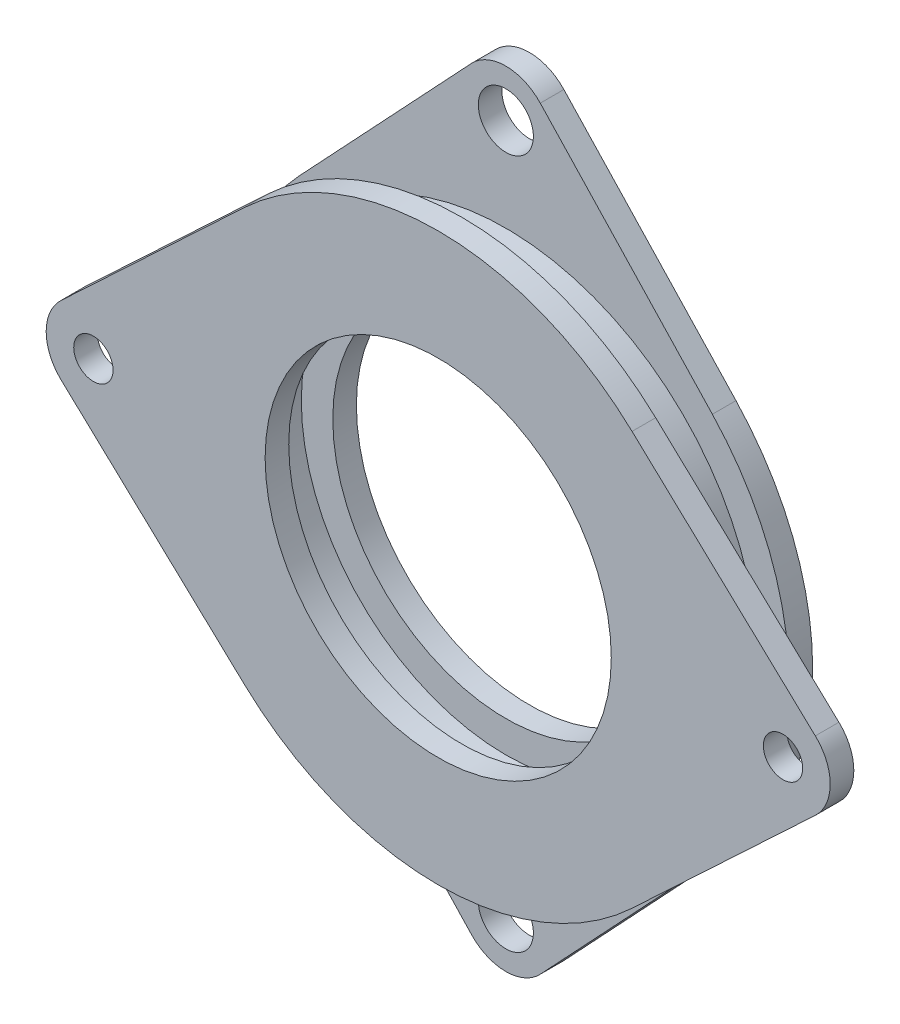
ISO-10303-21;
HEADER;
FILE_DESCRIPTION(('STEP AP214'),'2;1');
FILE_NAME('part.step','',(''),(''),'','','');
FILE_SCHEMA(('AUTOMOTIVE_DESIGN { 1 0 10303 214 1 1 1 1 }'));
ENDSEC;
DATA;
#1=APPLICATION_CONTEXT('core data for automotive mechanical design processes');
#2=APPLICATION_PROTOCOL_DEFINITION('international standard','automotive_design',2000,#1);
#3=PRODUCT_CONTEXT('',#1,'mechanical');
#4=PRODUCT('Part','Part','',(#3));
#5=PRODUCT_RELATED_PRODUCT_CATEGORY('part','',(#4));
#6=PRODUCT_DEFINITION_FORMATION('','',#4);
#7=PRODUCT_DEFINITION_CONTEXT('part definition',#1,'design');
#8=PRODUCT_DEFINITION('design','',#6,#7);
#9=PRODUCT_DEFINITION_SHAPE('','',#8);
#10=(LENGTH_UNIT() NAMED_UNIT(*) SI_UNIT(.MILLI.,.METRE.));
#11=(NAMED_UNIT(*) PLANE_ANGLE_UNIT() SI_UNIT($,.RADIAN.));
#12=(NAMED_UNIT(*) SI_UNIT($,.STERADIAN.) SOLID_ANGLE_UNIT());
#13=UNCERTAINTY_MEASURE_WITH_UNIT(LENGTH_MEASURE(1.E-05),#10,'distance_accuracy_value','');
#14=(GEOMETRIC_REPRESENTATION_CONTEXT(3) GLOBAL_UNCERTAINTY_ASSIGNED_CONTEXT((#13)) GLOBAL_UNIT_ASSIGNED_CONTEXT((#10,
#11,#12)) REPRESENTATION_CONTEXT('',''));
#15=CARTESIAN_POINT('',(0.,0.,0.));
#16=DIRECTION('',(0.,0.,1.));
#17=DIRECTION('',(1.,0.,0.));
#18=AXIS2_PLACEMENT_3D('',#15,#16,#17);
#19=CARTESIAN_POINT('',(0.,21.92,0.));
#20=DIRECTION('',(0.,0.,1.));
#21=DIRECTION('',(1.,0.,0.));
#22=AXIS2_PLACEMENT_3D('',#19,#20,#21);
#23=PLANE('',#22);
#24=CARTESIAN_POINT('',(0.,0.,0.));
#25=DIRECTION('',(0.,0.,-1.));
#26=DIRECTION('',(-1.,0.,0.));
#27=AXIS2_PLACEMENT_3D('',#24,#25,#26);
#28=CIRCLE('',#27,11.);
#29=CARTESIAN_POINT('',(-11.,0.,0.));
#30=VERTEX_POINT('',#29);
#31=EDGE_CURVE('E151',#30,#30,#28,.F.);
#32=ORIENTED_EDGE('',*,*,#31,.T.);
#33=EDGE_LOOP('',(#32));
#34=FACE_BOUND('',#33,.T.);
#35=CARTESIAN_POINT('',(0.,21.92,0.));
#36=DIRECTION('',(0.,0.,-1.));
#37=DIRECTION('',(-1.,0.,0.));
#38=AXIS2_PLACEMENT_3D('',#35,#36,#37);
#39=CIRCLE('',#38,1.75);
#40=CARTESIAN_POINT('',(-1.75,21.92,0.));
#41=VERTEX_POINT('',#40);
#42=EDGE_CURVE('E19',#41,#41,#39,.F.);
#43=ORIENTED_EDGE('',*,*,#42,.T.);
#44=EDGE_LOOP('',(#43));
#45=FACE_BOUND('',#44,.T.);
#46=CARTESIAN_POINT('',(0.,-21.92,0.));
#47=DIRECTION('',(0.,0.,-1.));
#48=DIRECTION('',(-1.,0.,0.));
#49=AXIS2_PLACEMENT_3D('',#46,#47,#48);
#50=CIRCLE('',#49,1.75);
#51=CARTESIAN_POINT('',(-1.75,-21.92,0.));
#52=VERTEX_POINT('',#51);
#53=EDGE_CURVE('E148',#52,#52,#50,.F.);
#54=ORIENTED_EDGE('',*,*,#53,.T.);
#55=EDGE_LOOP('',(#54));
#56=FACE_BOUND('',#55,.T.);
#57=DIRECTION('',(0.684306569343064,-0.729194431653127,0.));
#58=VECTOR('',#57,1.);
#59=CARTESIAN_POINT('',(2.18758329495941,23.9729197080292,0.));
#60=LINE('',#59,#58);
#61=CARTESIAN_POINT('',(2.18758329495941,23.9729197080292,0.));
#62=VERTEX_POINT('',#61);
#63=CARTESIAN_POINT('',(13.1254997697563,12.3175182481751,0.));
#64=VERTEX_POINT('',#63);
#65=EDGE_CURVE('E130',#62,#64,#60,.T.);
#66=ORIENTED_EDGE('',*,*,#65,.T.);
#67=CARTESIAN_POINT('',(0.,0.,0.));
#68=DIRECTION('',(0.,0.,-1.));
#69=DIRECTION('',(-1.,0.,0.));
#70=AXIS2_PLACEMENT_3D('',#67,#68,#69);
#71=CIRCLE('',#70,18.);
#72=CARTESIAN_POINT('',(13.1254997697563,-12.3175182481751,0.));
#73=VERTEX_POINT('',#72);
#74=EDGE_CURVE('E159',#73,#64,#71,.F.);
#75=ORIENTED_EDGE('',*,*,#74,.F.);
#76=DIRECTION('',(-0.684306569343064,-0.729194431653127,0.));
#77=VECTOR('',#76,1.);
#78=CARTESIAN_POINT('',(13.1254997697563,-12.3175182481751,0.));
#79=LINE('',#78,#77);
#80=CARTESIAN_POINT('',(2.1875832949594,-23.9729197080292,0.));
#81=VERTEX_POINT('',#80);
#82=EDGE_CURVE('E156',#73,#81,#79,.T.);
#83=ORIENTED_EDGE('',*,*,#82,.T.);
#84=CARTESIAN_POINT('',(0.,-21.92,0.));
#85=DIRECTION('',(0.,0.,-1.));
#86=DIRECTION('',(-1.,0.,0.));
#87=AXIS2_PLACEMENT_3D('',#84,#85,#86);
#88=CIRCLE('',#87,3.00000000000003);
#89=CARTESIAN_POINT('',(-2.18758329495941,-23.9729197080292,0.));
#90=VERTEX_POINT('',#89);
#91=EDGE_CURVE('E164',#90,#81,#88,.F.);
#92=ORIENTED_EDGE('',*,*,#91,.F.);
#93=DIRECTION('',(-0.684306569343064,0.729194431653127,0.));
#94=VECTOR('',#93,1.);
#95=CARTESIAN_POINT('',(-13.1254997697563,-12.3175182481751,0.));
#96=LINE('',#95,#94);
#97=CARTESIAN_POINT('',(-13.1254997697563,-12.3175182481751,0.));
#98=VERTEX_POINT('',#97);
#99=EDGE_CURVE('E161',#90,#98,#96,.T.);
#100=ORIENTED_EDGE('',*,*,#99,.T.);
#101=CARTESIAN_POINT('',(0.,0.,0.));
#102=DIRECTION('',(0.,0.,-1.));
#103=DIRECTION('',(-1.,0.,0.));
#104=AXIS2_PLACEMENT_3D('',#101,#102,#103);
#105=CIRCLE('',#104,18.);
#106=CARTESIAN_POINT('',(-13.1254997697563,12.3175182481751,0.));
#107=VERTEX_POINT('',#106);
#108=EDGE_CURVE('E166',#107,#98,#105,.F.);
#109=ORIENTED_EDGE('',*,*,#108,.F.);
#110=DIRECTION('',(0.684306569343064,0.729194431653127,0.));
#111=VECTOR('',#110,1.);
#112=CARTESIAN_POINT('',(-2.18758329495941,23.9729197080292,0.));
#113=LINE('',#112,#111);
#114=CARTESIAN_POINT('',(-2.18758329495941,23.9729197080292,0.));
#115=VERTEX_POINT('',#114);
#116=EDGE_CURVE('E133',#107,#115,#113,.T.);
#117=ORIENTED_EDGE('',*,*,#116,.T.);
#118=CARTESIAN_POINT('',(0.,21.92,0.));
#119=DIRECTION('',(0.,0.,-1.));
#120=DIRECTION('',(-1.,0.,0.));
#121=AXIS2_PLACEMENT_3D('',#118,#119,#120);
#122=CIRCLE('',#121,3.00000000000003);
#123=EDGE_CURVE('E127',#62,#115,#122,.F.);
#124=ORIENTED_EDGE('',*,*,#123,.F.);
#125=EDGE_LOOP('',(#66,#75,#83,#92,#100,#109,#117,#124));
#126=FACE_BOUND('',#125,.T.);
#127=ADVANCED_FACE('F16',(#34,#45,#56,#126),#23,.F.);
#128=CARTESIAN_POINT('',(0.,21.92,1.5));
#129=DIRECTION('',(0.,0.,-1.));
#130=DIRECTION('',(-1.,0.,0.));
#131=AXIS2_PLACEMENT_3D('',#128,#129,#130);
#132=CYLINDRICAL_SURFACE('',#131,1.75);
#133=ORIENTED_EDGE('',*,*,#42,.F.);
#134=EDGE_LOOP('',(#133));
#135=FACE_BOUND('',#134,.T.);
#136=CARTESIAN_POINT('',(0.,21.92,1.5));
#137=DIRECTION('',(0.,0.,-1.));
#138=DIRECTION('',(-1.,0.,0.));
#139=AXIS2_PLACEMENT_3D('',#136,#137,#138);
#140=CIRCLE('',#139,1.75);
#141=CARTESIAN_POINT('',(-1.75,21.92,1.5));
#142=VERTEX_POINT('',#141);
#143=EDGE_CURVE('E246',#142,#142,#140,.T.);
#144=ORIENTED_EDGE('',*,*,#143,.F.);
#145=EDGE_LOOP('',(#144));
#146=FACE_BOUND('',#145,.T.);
#147=ADVANCED_FACE('F426',(#135,#146),#132,.F.);
#148=CARTESIAN_POINT('',(0.,21.92,1.5));
#149=DIRECTION('',(0.,0.,-1.));
#150=DIRECTION('',(-1.,0.,0.));
#151=AXIS2_PLACEMENT_3D('',#148,#149,#150);
#152=CYLINDRICAL_SURFACE('',#151,3.00000000000003);
#153=CARTESIAN_POINT('',(0.,21.92,1.5));
#154=DIRECTION('',(0.,0.,-1.));
#155=DIRECTION('',(-1.,0.,0.));
#156=AXIS2_PLACEMENT_3D('',#153,#154,#155);
#157=CIRCLE('',#156,3.00000000000003);
#158=CARTESIAN_POINT('',(2.18758329495941,23.9729197080292,1.5));
#159=VERTEX_POINT('',#158);
#160=CARTESIAN_POINT('',(-2.18758329495941,23.9729197080292,1.5));
#161=VERTEX_POINT('',#160);
#162=EDGE_CURVE('E141',#159,#161,#157,.F.);
#163=ORIENTED_EDGE('',*,*,#162,.F.);
#164=DIRECTION('',(0.,0.,1.));
#165=VECTOR('',#164,1.);
#166=CARTESIAN_POINT('',(2.18758329495941,23.9729197080292,1.5));
#167=LINE('',#166,#165);
#168=EDGE_CURVE('E138',#159,#62,#167,.F.);
#169=ORIENTED_EDGE('',*,*,#168,.T.);
#170=ORIENTED_EDGE('',*,*,#123,.T.);
#171=DIRECTION('',(0.,0.,1.));
#172=VECTOR('',#171,1.);
#173=CARTESIAN_POINT('',(-2.18758329495941,23.9729197080292,1.5));
#174=LINE('',#173,#172);
#175=EDGE_CURVE('E136',#115,#161,#174,.T.);
#176=ORIENTED_EDGE('',*,*,#175,.T.);
#177=EDGE_LOOP('',(#163,#169,#170,#176));
#178=FACE_BOUND('',#177,.T.);
#179=ADVANCED_FACE('F139',(#178),#152,.T.);
#180=CARTESIAN_POINT('',(-2.18758329495941,23.9729197080292,1.5));
#181=DIRECTION('',(0.729194431653127,-0.684306569343064,0.));
#182=DIRECTION('',(0.684306569343064,0.729194431653127,0.));
#183=AXIS2_PLACEMENT_3D('',#180,#181,#182);
#184=PLANE('',#183);
#185=DIRECTION('',(0.,0.,-1.));
#186=VECTOR('',#185,1.);
#187=CARTESIAN_POINT('',(-13.1254997697563,12.3175182481751,1.5));
#188=LINE('',#187,#186);
#189=CARTESIAN_POINT('',(-13.1254997697563,12.3175182481751,1.5));
#190=VERTEX_POINT('',#189);
#191=EDGE_CURVE('E255',#190,#107,#188,.T.);
#192=ORIENTED_EDGE('',*,*,#191,.F.);
#193=DIRECTION('',(-0.684306569343064,-0.729194431653127,0.));
#194=VECTOR('',#193,1.);
#195=CARTESIAN_POINT('',(-2.18758329495941,23.9729197080292,1.5));
#196=LINE('',#195,#194);
#197=EDGE_CURVE('E244',#161,#190,#196,.T.);
#198=ORIENTED_EDGE('',*,*,#197,.F.);
#199=ORIENTED_EDGE('',*,*,#175,.F.);
#200=ORIENTED_EDGE('',*,*,#116,.F.);
#201=EDGE_LOOP('',(#192,#198,#199,#200));
#202=FACE_BOUND('',#201,.T.);
#203=ADVANCED_FACE('F421',(#202),#184,.F.);
#204=CARTESIAN_POINT('',(0.,0.,1.5));
#205=DIRECTION('',(0.,0.,-1.));
#206=DIRECTION('',(-1.,0.,0.));
#207=AXIS2_PLACEMENT_3D('',#204,#205,#206);
#208=CYLINDRICAL_SURFACE('',#207,18.);
#209=CARTESIAN_POINT('',(0.,0.,1.5));
#210=DIRECTION('',(0.,0.,-1.));
#211=DIRECTION('',(-1.,0.,0.));
#212=AXIS2_PLACEMENT_3D('',#209,#210,#211);
#213=CIRCLE('',#212,18.);
#214=CARTESIAN_POINT('',(-13.1254997697563,-12.3175182481751,1.5));
#215=VERTEX_POINT('',#214);
#216=EDGE_CURVE('E241',#190,#215,#213,.F.);
#217=ORIENTED_EDGE('',*,*,#216,.F.);
#218=ORIENTED_EDGE('',*,*,#191,.T.);
#219=ORIENTED_EDGE('',*,*,#108,.T.);
#220=DIRECTION('',(0.,0.,1.));
#221=VECTOR('',#220,1.);
#222=CARTESIAN_POINT('',(-13.1254997697563,-12.3175182481751,1.5));
#223=LINE('',#222,#221);
#224=EDGE_CURVE('E165',#98,#215,#223,.T.);
#225=ORIENTED_EDGE('',*,*,#224,.T.);
#226=EDGE_LOOP('',(#217,#218,#219,#225));
#227=FACE_BOUND('',#226,.T.);
#228=ADVANCED_FACE('F417',(#227),#208,.T.);
#229=CARTESIAN_POINT('',(-13.1254997697563,-12.3175182481751,1.5));
#230=DIRECTION('',(0.729194431653127,0.684306569343064,0.));
#231=DIRECTION('',(-0.684306569343064,0.729194431653127,0.));
#232=AXIS2_PLACEMENT_3D('',#229,#230,#231);
#233=PLANE('',#232);
#234=DIRECTION('',(0.,0.,-1.));
#235=VECTOR('',#234,1.);
#236=CARTESIAN_POINT('',(-2.18758329495941,-23.9729197080292,1.5));
#237=LINE('',#236,#235);
#238=CARTESIAN_POINT('',(-2.18758329495941,-23.9729197080292,1.5));
#239=VERTEX_POINT('',#238);
#240=EDGE_CURVE('E254',#239,#90,#237,.T.);
#241=ORIENTED_EDGE('',*,*,#240,.F.);
#242=DIRECTION('',(0.684306569343064,-0.729194431653127,0.));
#243=VECTOR('',#242,1.);
#244=CARTESIAN_POINT('',(-13.1254997697563,-12.3175182481751,1.5));
#245=LINE('',#244,#243);
#246=EDGE_CURVE('E240',#215,#239,#245,.T.);
#247=ORIENTED_EDGE('',*,*,#246,.F.);
#248=ORIENTED_EDGE('',*,*,#224,.F.);
#249=ORIENTED_EDGE('',*,*,#99,.F.);
#250=EDGE_LOOP('',(#241,#247,#248,#249));
#251=FACE_BOUND('',#250,.T.);
#252=ADVANCED_FACE('F413',(#251),#233,.F.);
#253=CARTESIAN_POINT('',(0.,-21.92,1.5));
#254=DIRECTION('',(0.,0.,-1.));
#255=DIRECTION('',(-1.,0.,0.));
#256=AXIS2_PLACEMENT_3D('',#253,#254,#255);
#257=CYLINDRICAL_SURFACE('',#256,3.00000000000003);
#258=CARTESIAN_POINT('',(0.,-21.92,1.5));
#259=DIRECTION('',(0.,0.,-1.));
#260=DIRECTION('',(-1.,0.,0.));
#261=AXIS2_PLACEMENT_3D('',#258,#259,#260);
#262=CIRCLE('',#261,3.00000000000003);
#263=CARTESIAN_POINT('',(2.18758329495941,-23.9729197080292,1.5));
#264=VERTEX_POINT('',#263);
#265=EDGE_CURVE('E237',#239,#264,#262,.F.);
#266=ORIENTED_EDGE('',*,*,#265,.F.);
#267=ORIENTED_EDGE('',*,*,#240,.T.);
#268=ORIENTED_EDGE('',*,*,#91,.T.);
#269=DIRECTION('',(0.,0.,1.));
#270=VECTOR('',#269,1.);
#271=CARTESIAN_POINT('',(2.1875832949594,-23.9729197080292,1.5));
#272=LINE('',#271,#270);
#273=EDGE_CURVE('E160',#81,#264,#272,.T.);
#274=ORIENTED_EDGE('',*,*,#273,.T.);
#275=EDGE_LOOP('',(#266,#267,#268,#274));
#276=FACE_BOUND('',#275,.T.);
#277=ADVANCED_FACE('F409',(#276),#257,.T.);
#278=CARTESIAN_POINT('',(13.1254997697563,-12.3175182481751,1.5));
#279=DIRECTION('',(-0.729194431653127,0.684306569343064,0.));
#280=DIRECTION('',(-0.684306569343064,-0.729194431653127,0.));
#281=AXIS2_PLACEMENT_3D('',#278,#279,#280);
#282=PLANE('',#281);
#283=DIRECTION('',(0.,0.,-1.));
#284=VECTOR('',#283,1.);
#285=CARTESIAN_POINT('',(13.1254997697563,-12.3175182481751,1.5));
#286=LINE('',#285,#284);
#287=CARTESIAN_POINT('',(13.1254997697563,-12.3175182481751,1.5));
#288=VERTEX_POINT('',#287);
#289=EDGE_CURVE('E252',#288,#73,#286,.T.);
#290=ORIENTED_EDGE('',*,*,#289,.F.);
#291=DIRECTION('',(0.684306569343064,0.729194431653127,0.));
#292=VECTOR('',#291,1.);
#293=CARTESIAN_POINT('',(2.18758329495941,-23.9729197080292,1.5));
#294=LINE('',#293,#292);
#295=EDGE_CURVE('E236',#264,#288,#294,.T.);
#296=ORIENTED_EDGE('',*,*,#295,.F.);
#297=ORIENTED_EDGE('',*,*,#273,.F.);
#298=ORIENTED_EDGE('',*,*,#82,.F.);
#299=EDGE_LOOP('',(#290,#296,#297,#298));
#300=FACE_BOUND('',#299,.T.);
#301=ADVANCED_FACE('F405',(#300),#282,.F.);
#302=CARTESIAN_POINT('',(0.,0.,1.5));
#303=DIRECTION('',(0.,0.,-1.));
#304=DIRECTION('',(-1.,0.,0.));
#305=AXIS2_PLACEMENT_3D('',#302,#303,#304);
#306=CYLINDRICAL_SURFACE('',#305,18.);
#307=CARTESIAN_POINT('',(0.,0.,1.5));
#308=DIRECTION('',(0.,0.,-1.));
#309=DIRECTION('',(-1.,0.,0.));
#310=AXIS2_PLACEMENT_3D('',#307,#308,#309);
#311=CIRCLE('',#310,18.);
#312=CARTESIAN_POINT('',(13.1254997697563,12.3175182481751,1.5));
#313=VERTEX_POINT('',#312);
#314=EDGE_CURVE('E233',#288,#313,#311,.F.);
#315=ORIENTED_EDGE('',*,*,#314,.F.);
#316=ORIENTED_EDGE('',*,*,#289,.T.);
#317=ORIENTED_EDGE('',*,*,#74,.T.);
#318=DIRECTION('',(0.,0.,1.));
#319=VECTOR('',#318,1.);
#320=CARTESIAN_POINT('',(13.1254997697563,12.3175182481751,1.5));
#321=LINE('',#320,#319);
#322=EDGE_CURVE('E145',#64,#313,#321,.T.);
#323=ORIENTED_EDGE('',*,*,#322,.T.);
#324=EDGE_LOOP('',(#315,#316,#317,#323));
#325=FACE_BOUND('',#324,.T.);
#326=ADVANCED_FACE('F402',(#325),#306,.T.);
#327=CARTESIAN_POINT('',(2.18758329495941,23.9729197080292,1.5));
#328=DIRECTION('',(-0.729194431653127,-0.684306569343064,0.));
#329=DIRECTION('',(0.684306569343064,-0.729194431653127,0.));
#330=AXIS2_PLACEMENT_3D('',#327,#328,#329);
#331=PLANE('',#330);
#332=ORIENTED_EDGE('',*,*,#168,.F.);
#333=DIRECTION('',(-0.684306569343064,0.729194431653127,0.));
#334=VECTOR('',#333,1.);
#335=CARTESIAN_POINT('',(13.1254997697563,12.3175182481751,1.5));
#336=LINE('',#335,#334);
#337=EDGE_CURVE('E232',#313,#159,#336,.T.);
#338=ORIENTED_EDGE('',*,*,#337,.F.);
#339=ORIENTED_EDGE('',*,*,#322,.F.);
#340=ORIENTED_EDGE('',*,*,#65,.F.);
#341=EDGE_LOOP('',(#332,#338,#339,#340));
#342=FACE_BOUND('',#341,.T.);
#343=ADVANCED_FACE('F147',(#342),#331,.F.);
#344=CARTESIAN_POINT('',(0.,-21.92,1.5));
#345=DIRECTION('',(0.,0.,-1.));
#346=DIRECTION('',(-1.,0.,0.));
#347=AXIS2_PLACEMENT_3D('',#344,#345,#346);
#348=CYLINDRICAL_SURFACE('',#347,1.75);
#349=ORIENTED_EDGE('',*,*,#53,.F.);
#350=EDGE_LOOP('',(#349));
#351=FACE_BOUND('',#350,.T.);
#352=CARTESIAN_POINT('',(0.,-21.92,1.5));
#353=DIRECTION('',(0.,0.,-1.));
#354=DIRECTION('',(-1.,0.,0.));
#355=AXIS2_PLACEMENT_3D('',#352,#353,#354);
#356=CIRCLE('',#355,1.75);
#357=CARTESIAN_POINT('',(-1.75,-21.92,1.5));
#358=VERTEX_POINT('',#357);
#359=EDGE_CURVE('E229',#358,#358,#356,.T.);
#360=ORIENTED_EDGE('',*,*,#359,.F.);
#361=EDGE_LOOP('',(#360));
#362=FACE_BOUND('',#361,.T.);
#363=ADVANCED_FACE('F395',(#351,#362),#348,.F.);
#364=CARTESIAN_POINT('',(0.,0.,1.5));
#365=DIRECTION('',(0.,0.,-1.));
#366=DIRECTION('',(-1.,0.,0.));
#367=AXIS2_PLACEMENT_3D('',#364,#365,#366);
#368=CYLINDRICAL_SURFACE('',#367,11.);
#369=ORIENTED_EDGE('',*,*,#31,.F.);
#370=EDGE_LOOP('',(#369));
#371=FACE_BOUND('',#370,.T.);
#372=CARTESIAN_POINT('',(0.,0.,1.5));
#373=DIRECTION('',(0.,0.,-1.));
#374=DIRECTION('',(-1.,0.,0.));
#375=AXIS2_PLACEMENT_3D('',#372,#373,#374);
#376=CIRCLE('',#375,11.);
#377=CARTESIAN_POINT('',(-11.,0.,1.5));
#378=VERTEX_POINT('',#377);
#379=EDGE_CURVE('E226',#378,#378,#376,.T.);
#380=ORIENTED_EDGE('',*,*,#379,.F.);
#381=EDGE_LOOP('',(#380));
#382=FACE_BOUND('',#381,.T.);
#383=ADVANCED_FACE('F391',(#371,#382),#368,.F.);
#384=CARTESIAN_POINT('',(0.,21.92,1.5));
#385=DIRECTION('',(0.,0.,1.));
#386=DIRECTION('',(1.,0.,0.));
#387=AXIS2_PLACEMENT_3D('',#384,#385,#386);
#388=PLANE('',#387);
#389=ORIENTED_EDGE('',*,*,#359,.T.);
#390=EDGE_LOOP('',(#389));
#391=FACE_BOUND('',#390,.T.);
#392=ORIENTED_EDGE('',*,*,#314,.T.);
#393=ORIENTED_EDGE('',*,*,#337,.T.);
#394=ORIENTED_EDGE('',*,*,#162,.T.);
#395=ORIENTED_EDGE('',*,*,#197,.T.);
#396=ORIENTED_EDGE('',*,*,#216,.T.);
#397=ORIENTED_EDGE('',*,*,#246,.T.);
#398=ORIENTED_EDGE('',*,*,#265,.T.);
#399=ORIENTED_EDGE('',*,*,#295,.T.);
#400=EDGE_LOOP('',(#392,#393,#394,#395,#396,#397,#398,#399));
#401=FACE_BOUND('',#400,.T.);
#402=ORIENTED_EDGE('',*,*,#143,.T.);
#403=EDGE_LOOP('',(#402));
#404=FACE_BOUND('',#403,.T.);
#405=CARTESIAN_POINT('',(0.,0.,1.5));
#406=DIRECTION('',(0.,0.,-1.));
#407=DIRECTION('',(-1.,0.,0.));
#408=AXIS2_PLACEMENT_3D('',#405,#406,#407);
#409=CIRCLE('',#408,16.);
#410=CARTESIAN_POINT('',(-16.,0.,1.5));
#411=VERTEX_POINT('',#410);
#412=EDGE_CURVE('E223',#411,#411,#409,.F.);
#413=ORIENTED_EDGE('',*,*,#412,.F.);
#414=EDGE_LOOP('',(#413));
#415=FACE_BOUND('',#414,.T.);
#416=ADVANCED_FACE('F385',(#391,#401,#404,#415),#388,.T.);
#417=CARTESIAN_POINT('',(0.,21.92,1.5));
#418=DIRECTION('',(0.,0.,1.));
#419=DIRECTION('',(1.,0.,0.));
#420=AXIS2_PLACEMENT_3D('',#417,#418,#419);
#421=PLANE('',#420);
#422=CARTESIAN_POINT('',(0.,0.,1.5));
#423=DIRECTION('',(0.,0.,-1.));
#424=DIRECTION('',(-1.,0.,0.));
#425=AXIS2_PLACEMENT_3D('',#422,#423,#424);
#426=CIRCLE('',#425,13.);
#427=CARTESIAN_POINT('',(-13.,0.,1.5));
#428=VERTEX_POINT('',#427);
#429=EDGE_CURVE('E220',#428,#428,#426,.F.);
#430=ORIENTED_EDGE('',*,*,#429,.T.);
#431=EDGE_LOOP('',(#430));
#432=FACE_BOUND('',#431,.T.);
#433=ORIENTED_EDGE('',*,*,#379,.T.);
#434=EDGE_LOOP('',(#433));
#435=FACE_BOUND('',#434,.T.);
#436=ADVANCED_FACE('F376',(#432,#435),#421,.T.);
#437=CARTESIAN_POINT('',(0.,0.,4.3));
#438=DIRECTION('',(0.,0.,-1.));
#439=DIRECTION('',(-1.,0.,0.));
#440=AXIS2_PLACEMENT_3D('',#437,#438,#439);
#441=CYLINDRICAL_SURFACE('',#440,16.);
#442=ORIENTED_EDGE('',*,*,#412,.T.);
#443=EDGE_LOOP('',(#442));
#444=FACE_BOUND('',#443,.T.);
#445=CARTESIAN_POINT('',(0.,0.,4.3));
#446=DIRECTION('',(0.,0.,-1.));
#447=DIRECTION('',(-1.,0.,0.));
#448=AXIS2_PLACEMENT_3D('',#445,#446,#447);
#449=CIRCLE('',#448,16.);
#450=CARTESIAN_POINT('',(-16.,0.,4.3));
#451=VERTEX_POINT('',#450);
#452=EDGE_CURVE('E217',#451,#451,#449,.T.);
#453=ORIENTED_EDGE('',*,*,#452,.T.);
#454=EDGE_LOOP('',(#453));
#455=FACE_BOUND('',#454,.T.);
#456=ADVANCED_FACE('F374',(#444,#455),#441,.T.);
#457=CARTESIAN_POINT('',(0.,0.,4.3));
#458=DIRECTION('',(0.,0.,-1.));
#459=DIRECTION('',(-1.,0.,0.));
#460=AXIS2_PLACEMENT_3D('',#457,#458,#459);
#461=CYLINDRICAL_SURFACE('',#460,13.);
#462=ORIENTED_EDGE('',*,*,#429,.F.);
#463=EDGE_LOOP('',(#462));
#464=FACE_BOUND('',#463,.T.);
#465=CARTESIAN_POINT('',(0.,0.,4.3));
#466=DIRECTION('',(0.,0.,-1.));
#467=DIRECTION('',(-1.,0.,0.));
#468=AXIS2_PLACEMENT_3D('',#465,#466,#467);
#469=CIRCLE('',#468,13.);
#470=CARTESIAN_POINT('',(-13.,0.,4.3));
#471=VERTEX_POINT('',#470);
#472=EDGE_CURVE('E214',#471,#471,#469,.F.);
#473=ORIENTED_EDGE('',*,*,#472,.T.);
#474=EDGE_LOOP('',(#473));
#475=FACE_BOUND('',#474,.T.);
#476=ADVANCED_FACE('F368',(#464,#475),#461,.F.);
#477=CARTESIAN_POINT('',(0.,0.,4.3));
#478=DIRECTION('',(0.,0.,1.));
#479=DIRECTION('',(1.,0.,0.));
#480=AXIS2_PLACEMENT_3D('',#477,#478,#479);
#481=PLANE('',#480);
#482=CARTESIAN_POINT('',(21.915,0.,4.3));
#483=DIRECTION('',(0.,0.,-1.));
#484=DIRECTION('',(-1.,0.,0.));
#485=AXIS2_PLACEMENT_3D('',#482,#483,#484);
#486=CIRCLE('',#485,1.25);
#487=CARTESIAN_POINT('',(20.665,0.,4.3));
#488=VERTEX_POINT('',#487);
#489=EDGE_CURVE('E211',#488,#488,#486,.F.);
#490=ORIENTED_EDGE('',*,*,#489,.T.);
#491=EDGE_LOOP('',(#490));
#492=FACE_BOUND('',#491,.T.);
#493=CARTESIAN_POINT('',(-21.915,0.,4.3));
#494=DIRECTION('',(0.,0.,-1.));
#495=DIRECTION('',(-1.,0.,0.));
#496=AXIS2_PLACEMENT_3D('',#493,#494,#495);
#497=CIRCLE('',#496,1.25);
#498=CARTESIAN_POINT('',(-23.165,0.,4.3));
#499=VERTEX_POINT('',#498);
#500=EDGE_CURVE('E192',#499,#499,#497,.F.);
#501=ORIENTED_EDGE('',*,*,#500,.T.);
#502=EDGE_LOOP('',(#501));
#503=FACE_BOUND('',#502,.T.);
#504=DIRECTION('',(0.729047883689756,-0.684462696783022,0.));
#505=VECTOR('',#504,1.);
#506=CARTESIAN_POINT('',(23.9683880903491,2.18714365106934,4.3));
#507=LINE('',#506,#505);
#508=CARTESIAN_POINT('',(12.3203285420944,13.1228619064156,4.3));
#509=VERTEX_POINT('',#508);
#510=CARTESIAN_POINT('',(23.9683880903491,2.18714365106935,4.3));
#511=VERTEX_POINT('',#510);
#512=EDGE_CURVE('E195',#509,#511,#507,.T.);
#513=ORIENTED_EDGE('',*,*,#512,.T.);
#514=CARTESIAN_POINT('',(21.915,0.,4.3));
#515=DIRECTION('',(0.,0.,-1.));
#516=DIRECTION('',(-1.,0.,0.));
#517=AXIS2_PLACEMENT_3D('',#514,#515,#516);
#518=CIRCLE('',#517,3.);
#519=CARTESIAN_POINT('',(23.9683880903491,-2.18714365106918,4.3));
#520=VERTEX_POINT('',#519);
#521=EDGE_CURVE('E196',#520,#511,#518,.F.);
#522=ORIENTED_EDGE('',*,*,#521,.F.);
#523=DIRECTION('',(-0.729047883689751,-0.684462696783028,0.));
#524=VECTOR('',#523,1.);
#525=CARTESIAN_POINT('',(12.3203285420945,-13.1228619064155,4.3));
#526=LINE('',#525,#524);
#527=CARTESIAN_POINT('',(12.3203285420945,-13.1228619064155,4.3));
#528=VERTEX_POINT('',#527);
#529=EDGE_CURVE('E199',#520,#528,#526,.T.);
#530=ORIENTED_EDGE('',*,*,#529,.T.);
#531=CARTESIAN_POINT('',(0.,0.,4.3));
#532=DIRECTION('',(0.,0.,-1.));
#533=DIRECTION('',(-1.,0.,0.));
#534=AXIS2_PLACEMENT_3D('',#531,#532,#533);
#535=CIRCLE('',#534,18.);
#536=CARTESIAN_POINT('',(-12.3203285420944,-13.1228619064156,4.3));
#537=VERTEX_POINT('',#536);
#538=EDGE_CURVE('E200',#537,#528,#535,.F.);
#539=ORIENTED_EDGE('',*,*,#538,.F.);
#540=DIRECTION('',(-0.729047883689756,0.684462696783022,0.));
#541=VECTOR('',#540,1.);
#542=CARTESIAN_POINT('',(-23.9683880903491,-2.18714365106935,4.3));
#543=LINE('',#542,#541);
#544=CARTESIAN_POINT('',(-23.9683880903491,-2.18714365106935,4.3));
#545=VERTEX_POINT('',#544);
#546=EDGE_CURVE('E203',#537,#545,#543,.T.);
#547=ORIENTED_EDGE('',*,*,#546,.T.);
#548=CARTESIAN_POINT('',(-21.915,0.,4.3));
#549=DIRECTION('',(0.,0.,-1.));
#550=DIRECTION('',(-1.,0.,0.));
#551=AXIS2_PLACEMENT_3D('',#548,#549,#550);
#552=CIRCLE('',#551,3.);
#553=CARTESIAN_POINT('',(-23.9683880903491,2.18714365106918,4.3));
#554=VERTEX_POINT('',#553);
#555=EDGE_CURVE('E204',#554,#545,#552,.F.);
#556=ORIENTED_EDGE('',*,*,#555,.F.);
#557=DIRECTION('',(0.729047883689751,0.684462696783028,0.));
#558=VECTOR('',#557,1.);
#559=CARTESIAN_POINT('',(-12.3203285420945,13.1228619064155,4.3));
#560=LINE('',#559,#558);
#561=CARTESIAN_POINT('',(-12.3203285420945,13.1228619064155,4.3));
#562=VERTEX_POINT('',#561);
#563=EDGE_CURVE('E207',#554,#562,#560,.T.);
#564=ORIENTED_EDGE('',*,*,#563,.T.);
#565=CARTESIAN_POINT('',(0.,0.,4.3));
#566=DIRECTION('',(0.,0.,-1.));
#567=DIRECTION('',(-1.,0.,0.));
#568=AXIS2_PLACEMENT_3D('',#565,#566,#567);
#569=CIRCLE('',#568,18.);
#570=EDGE_CURVE('E208',#509,#562,#569,.F.);
#571=ORIENTED_EDGE('',*,*,#570,.F.);
#572=EDGE_LOOP('',(#513,#522,#530,#539,#547,#556,#564,#571));
#573=FACE_BOUND('',#572,.T.);
#574=ORIENTED_EDGE('',*,*,#452,.F.);
#575=EDGE_LOOP('',(#574));
#576=FACE_BOUND('',#575,.T.);
#577=ADVANCED_FACE('F364',(#492,#503,#573,#576),#481,.F.);
#578=CARTESIAN_POINT('',(0.,0.,4.3));
#579=DIRECTION('',(0.,0.,1.));
#580=DIRECTION('',(1.,0.,0.));
#581=AXIS2_PLACEMENT_3D('',#578,#579,#580);
#582=PLANE('',#581);
#583=ORIENTED_EDGE('',*,*,#472,.F.);
#584=EDGE_LOOP('',(#583));
#585=FACE_BOUND('',#584,.T.);
#586=CARTESIAN_POINT('',(0.,0.,4.3));
#587=DIRECTION('',(0.,0.,-1.));
#588=DIRECTION('',(-1.,0.,0.));
#589=AXIS2_PLACEMENT_3D('',#586,#587,#588);
#590=CIRCLE('',#589,11.);
#591=CARTESIAN_POINT('',(-11.,0.,4.3));
#592=VERTEX_POINT('',#591);
#593=EDGE_CURVE('E189',#592,#592,#590,.F.);
#594=ORIENTED_EDGE('',*,*,#593,.T.);
#595=EDGE_LOOP('',(#594));
#596=FACE_BOUND('',#595,.T.);
#597=ADVANCED_FACE('F367',(#585,#596),#582,.F.);
#598=CARTESIAN_POINT('',(21.915,0.,5.8));
#599=DIRECTION('',(0.,0.,-1.));
#600=DIRECTION('',(-1.,0.,0.));
#601=AXIS2_PLACEMENT_3D('',#598,#599,#600);
#602=CYLINDRICAL_SURFACE('',#601,1.25);
#603=ORIENTED_EDGE('',*,*,#489,.F.);
#604=EDGE_LOOP('',(#603));
#605=FACE_BOUND('',#604,.T.);
#606=CARTESIAN_POINT('',(21.915,0.,5.8));
#607=DIRECTION('',(0.,0.,-1.));
#608=DIRECTION('',(-1.,0.,0.));
#609=AXIS2_PLACEMENT_3D('',#606,#607,#608);
#610=CIRCLE('',#609,1.25);
#611=CARTESIAN_POINT('',(20.665,0.,5.8));
#612=VERTEX_POINT('',#611);
#613=EDGE_CURVE('E186',#612,#612,#610,.T.);
#614=ORIENTED_EDGE('',*,*,#613,.F.);
#615=EDGE_LOOP('',(#614));
#616=FACE_BOUND('',#615,.T.);
#617=ADVANCED_FACE('F572',(#605,#616),#602,.F.);
#618=CARTESIAN_POINT('',(0.,0.,5.8));
#619=DIRECTION('',(0.,0.,-1.));
#620=DIRECTION('',(-1.,0.,0.));
#621=AXIS2_PLACEMENT_3D('',#618,#619,#620);
#622=CYLINDRICAL_SURFACE('',#621,18.);
#623=CARTESIAN_POINT('',(0.,0.,5.8));
#624=DIRECTION('',(0.,0.,-1.));
#625=DIRECTION('',(-1.,0.,0.));
#626=AXIS2_PLACEMENT_3D('',#623,#624,#625);
#627=CIRCLE('',#626,18.);
#628=CARTESIAN_POINT('',(12.3203285420944,13.1228619064156,5.8));
#629=VERTEX_POINT('',#628);
#630=CARTESIAN_POINT('',(-12.3203285420945,13.1228619064155,5.8));
#631=VERTEX_POINT('',#630);
#632=EDGE_CURVE('E183',#629,#631,#627,.F.);
#633=ORIENTED_EDGE('',*,*,#632,.F.);
#634=DIRECTION('',(0.,0.,1.));
#635=VECTOR('',#634,1.);
#636=CARTESIAN_POINT('',(12.3203285420944,13.1228619064156,5.8));
#637=LINE('',#636,#635);
#638=EDGE_CURVE('E284',#629,#509,#637,.F.);
#639=ORIENTED_EDGE('',*,*,#638,.T.);
#640=ORIENTED_EDGE('',*,*,#570,.T.);
#641=DIRECTION('',(0.,0.,1.));
#642=VECTOR('',#641,1.);
#643=CARTESIAN_POINT('',(-12.3203285420945,13.1228619064155,5.8));
#644=LINE('',#643,#642);
#645=EDGE_CURVE('E210',#562,#631,#644,.T.);
#646=ORIENTED_EDGE('',*,*,#645,.T.);
#647=EDGE_LOOP('',(#633,#639,#640,#646));
#648=FACE_BOUND('',#647,.T.);
#649=ADVANCED_FACE('F312',(#648),#622,.T.);
#650=CARTESIAN_POINT('',(-12.3203285420945,13.1228619064155,5.8));
#651=DIRECTION('',(0.684462696783028,-0.729047883689751,0.));
#652=DIRECTION('',(0.729047883689751,0.684462696783028,0.));
#653=AXIS2_PLACEMENT_3D('',#650,#651,#652);
#654=PLANE('',#653);
#655=DIRECTION('',(0.,0.,-1.));
#656=VECTOR('',#655,1.);
#657=CARTESIAN_POINT('',(-23.9683880903491,2.18714365106918,5.8));
#658=LINE('',#657,#656);
#659=CARTESIAN_POINT('',(-23.9683880903491,2.18714365106918,5.8));
#660=VERTEX_POINT('',#659);
#661=EDGE_CURVE('E206',#660,#554,#658,.T.);
#662=ORIENTED_EDGE('',*,*,#661,.F.);
#663=DIRECTION('',(-0.729047883689751,-0.684462696783028,0.));
#664=VECTOR('',#663,1.);
#665=CARTESIAN_POINT('',(-12.3203285420945,13.1228619064155,5.8));
#666=LINE('',#665,#664);
#667=EDGE_CURVE('E182',#631,#660,#666,.T.);
#668=ORIENTED_EDGE('',*,*,#667,.F.);
#669=ORIENTED_EDGE('',*,*,#645,.F.);
#670=ORIENTED_EDGE('',*,*,#563,.F.);
#671=EDGE_LOOP('',(#662,#668,#669,#670));
#672=FACE_BOUND('',#671,.T.);
#673=ADVANCED_FACE('F317',(#672),#654,.F.);
#674=CARTESIAN_POINT('',(-21.915,0.,5.8));
#675=DIRECTION('',(0.,0.,-1.));
#676=DIRECTION('',(-1.,0.,0.));
#677=AXIS2_PLACEMENT_3D('',#674,#675,#676);
#678=CYLINDRICAL_SURFACE('',#677,3.);
#679=CARTESIAN_POINT('',(-21.915,0.,5.8));
#680=DIRECTION('',(0.,0.,-1.));
#681=DIRECTION('',(-1.,0.,0.));
#682=AXIS2_PLACEMENT_3D('',#679,#680,#681);
#683=CIRCLE('',#682,3.);
#684=CARTESIAN_POINT('',(-23.9683880903491,-2.18714365106935,5.8));
#685=VERTEX_POINT('',#684);
#686=EDGE_CURVE('E179',#660,#685,#683,.F.);
#687=ORIENTED_EDGE('',*,*,#686,.F.);
#688=ORIENTED_EDGE('',*,*,#661,.T.);
#689=ORIENTED_EDGE('',*,*,#555,.T.);
#690=DIRECTION('',(0.,0.,1.));
#691=VECTOR('',#690,1.);
#692=CARTESIAN_POINT('',(-23.9683880903491,-2.18714365106935,5.8));
#693=LINE('',#692,#691);
#694=EDGE_CURVE('E278',#545,#685,#693,.T.);
#695=ORIENTED_EDGE('',*,*,#694,.T.);
#696=EDGE_LOOP('',(#687,#688,#689,#695));
#697=FACE_BOUND('',#696,.T.);
#698=ADVANCED_FACE('F321',(#697),#678,.T.);
#699=CARTESIAN_POINT('',(-23.9683880903491,-2.18714365106935,5.8));
#700=DIRECTION('',(0.684462696783022,0.729047883689756,0.));
#701=DIRECTION('',(-0.729047883689756,0.684462696783022,0.));
#702=AXIS2_PLACEMENT_3D('',#699,#700,#701);
#703=PLANE('',#702);
#704=DIRECTION('',(0.,0.,-1.));
#705=VECTOR('',#704,1.);
#706=CARTESIAN_POINT('',(-12.3203285420944,-13.1228619064156,5.8));
#707=LINE('',#706,#705);
#708=CARTESIAN_POINT('',(-12.3203285420944,-13.1228619064156,5.8));
#709=VERTEX_POINT('',#708);
#710=EDGE_CURVE('E202',#709,#537,#707,.T.);
#711=ORIENTED_EDGE('',*,*,#710,.F.);
#712=DIRECTION('',(0.729047883689756,-0.684462696783023,0.));
#713=VECTOR('',#712,1.);
#714=CARTESIAN_POINT('',(-23.9683880903491,-2.18714365106935,5.8));
#715=LINE('',#714,#713);
#716=EDGE_CURVE('E178',#685,#709,#715,.T.);
#717=ORIENTED_EDGE('',*,*,#716,.F.);
#718=ORIENTED_EDGE('',*,*,#694,.F.);
#719=ORIENTED_EDGE('',*,*,#546,.F.);
#720=EDGE_LOOP('',(#711,#717,#718,#719));
#721=FACE_BOUND('',#720,.T.);
#722=ADVANCED_FACE('F325',(#721),#703,.F.);
#723=CARTESIAN_POINT('',(0.,0.,5.8));
#724=DIRECTION('',(0.,0.,-1.));
#725=DIRECTION('',(-1.,0.,0.));
#726=AXIS2_PLACEMENT_3D('',#723,#724,#725);
#727=CYLINDRICAL_SURFACE('',#726,18.);
#728=CARTESIAN_POINT('',(0.,0.,5.8));
#729=DIRECTION('',(0.,0.,-1.));
#730=DIRECTION('',(-1.,0.,0.));
#731=AXIS2_PLACEMENT_3D('',#728,#729,#730);
#732=CIRCLE('',#731,18.);
#733=CARTESIAN_POINT('',(12.3203285420945,-13.1228619064155,5.8));
#734=VERTEX_POINT('',#733);
#735=EDGE_CURVE('E175',#709,#734,#732,.F.);
#736=ORIENTED_EDGE('',*,*,#735,.F.);
#737=ORIENTED_EDGE('',*,*,#710,.T.);
#738=ORIENTED_EDGE('',*,*,#538,.T.);
#739=DIRECTION('',(0.,0.,1.));
#740=VECTOR('',#739,1.);
#741=CARTESIAN_POINT('',(12.3203285420945,-13.1228619064155,5.8));
#742=LINE('',#741,#740);
#743=EDGE_CURVE('E281',#528,#734,#742,.T.);
#744=ORIENTED_EDGE('',*,*,#743,.T.);
#745=EDGE_LOOP('',(#736,#737,#738,#744));
#746=FACE_BOUND('',#745,.T.);
#747=ADVANCED_FACE('F328',(#746),#727,.T.);
#748=CARTESIAN_POINT('',(12.3203285420945,-13.1228619064155,5.8));
#749=DIRECTION('',(-0.684462696783028,0.729047883689751,0.));
#750=DIRECTION('',(-0.729047883689751,-0.684462696783028,0.));
#751=AXIS2_PLACEMENT_3D('',#748,#749,#750);
#752=PLANE('',#751);
#753=DIRECTION('',(0.,0.,-1.));
#754=VECTOR('',#753,1.);
#755=CARTESIAN_POINT('',(23.9683880903491,-2.18714365106918,5.8));
#756=LINE('',#755,#754);
#757=CARTESIAN_POINT('',(23.9683880903491,-2.18714365106918,5.8));
#758=VERTEX_POINT('',#757);
#759=EDGE_CURVE('E198',#758,#520,#756,.T.);
#760=ORIENTED_EDGE('',*,*,#759,.F.);
#761=DIRECTION('',(0.729047883689751,0.684462696783028,0.));
#762=VECTOR('',#761,1.);
#763=CARTESIAN_POINT('',(12.3203285420945,-13.1228619064155,5.8));
#764=LINE('',#763,#762);
#765=EDGE_CURVE('E174',#734,#758,#764,.T.);
#766=ORIENTED_EDGE('',*,*,#765,.F.);
#767=ORIENTED_EDGE('',*,*,#743,.F.);
#768=ORIENTED_EDGE('',*,*,#529,.F.);
#769=EDGE_LOOP('',(#760,#766,#767,#768));
#770=FACE_BOUND('',#769,.T.);
#771=ADVANCED_FACE('F332',(#770),#752,.F.);
#772=CARTESIAN_POINT('',(21.915,0.,5.8));
#773=DIRECTION('',(0.,0.,-1.));
#774=DIRECTION('',(-1.,0.,0.));
#775=AXIS2_PLACEMENT_3D('',#772,#773,#774);
#776=CYLINDRICAL_SURFACE('',#775,3.);
#777=CARTESIAN_POINT('',(21.915,0.,5.8));
#778=DIRECTION('',(0.,0.,-1.));
#779=DIRECTION('',(-1.,0.,0.));
#780=AXIS2_PLACEMENT_3D('',#777,#778,#779);
#781=CIRCLE('',#780,3.);
#782=CARTESIAN_POINT('',(23.9683880903491,2.18714365106934,5.8));
#783=VERTEX_POINT('',#782);
#784=EDGE_CURVE('E171',#758,#783,#781,.F.);
#785=ORIENTED_EDGE('',*,*,#784,.F.);
#786=ORIENTED_EDGE('',*,*,#759,.T.);
#787=ORIENTED_EDGE('',*,*,#521,.T.);
#788=DIRECTION('',(0.,0.,1.));
#789=VECTOR('',#788,1.);
#790=CARTESIAN_POINT('',(23.9683880903491,2.18714365106934,5.8));
#791=LINE('',#790,#789);
#792=EDGE_CURVE('E34',#511,#783,#791,.T.);
#793=ORIENTED_EDGE('',*,*,#792,.T.);
#794=EDGE_LOOP('',(#785,#786,#787,#793));
#795=FACE_BOUND('',#794,.T.);
#796=ADVANCED_FACE('F334',(#795),#776,.T.);
#797=CARTESIAN_POINT('',(23.9683880903491,2.18714365106934,5.8));
#798=DIRECTION('',(-0.684462696783022,-0.729047883689756,0.));
#799=DIRECTION('',(0.729047883689756,-0.684462696783022,0.));
#800=AXIS2_PLACEMENT_3D('',#797,#798,#799);
#801=PLANE('',#800);
#802=ORIENTED_EDGE('',*,*,#638,.F.);
#803=DIRECTION('',(-0.729047883689756,0.684462696783023,0.));
#804=VECTOR('',#803,1.);
#805=CARTESIAN_POINT('',(23.9683880903491,2.18714365106934,5.8));
#806=LINE('',#805,#804);
#807=EDGE_CURVE('E170',#783,#629,#806,.T.);
#808=ORIENTED_EDGE('',*,*,#807,.F.);
#809=ORIENTED_EDGE('',*,*,#792,.F.);
#810=ORIENTED_EDGE('',*,*,#512,.F.);
#811=EDGE_LOOP('',(#802,#808,#809,#810));
#812=FACE_BOUND('',#811,.T.);
#813=ADVANCED_FACE('F309',(#812),#801,.F.);
#814=CARTESIAN_POINT('',(-21.915,0.,5.8));
#815=DIRECTION('',(0.,0.,-1.));
#816=DIRECTION('',(-1.,0.,0.));
#817=AXIS2_PLACEMENT_3D('',#814,#815,#816);
#818=CYLINDRICAL_SURFACE('',#817,1.25);
#819=ORIENTED_EDGE('',*,*,#500,.F.);
#820=EDGE_LOOP('',(#819));
#821=FACE_BOUND('',#820,.T.);
#822=CARTESIAN_POINT('',(-21.915,0.,5.8));
#823=DIRECTION('',(0.,0.,-1.));
#824=DIRECTION('',(-1.,0.,0.));
#825=AXIS2_PLACEMENT_3D('',#822,#823,#824);
#826=CIRCLE('',#825,1.25);
#827=CARTESIAN_POINT('',(-23.165,0.,5.8));
#828=VERTEX_POINT('',#827);
#829=EDGE_CURVE('E25',#828,#828,#826,.T.);
#830=ORIENTED_EDGE('',*,*,#829,.F.);
#831=EDGE_LOOP('',(#830));
#832=FACE_BOUND('',#831,.T.);
#833=ADVANCED_FACE('F342',(#821,#832),#818,.F.);
#834=CARTESIAN_POINT('',(0.,0.,5.8));
#835=DIRECTION('',(0.,0.,-1.));
#836=DIRECTION('',(-1.,0.,0.));
#837=AXIS2_PLACEMENT_3D('',#834,#835,#836);
#838=CYLINDRICAL_SURFACE('',#837,11.);
#839=ORIENTED_EDGE('',*,*,#593,.F.);
#840=EDGE_LOOP('',(#839));
#841=FACE_BOUND('',#840,.T.);
#842=CARTESIAN_POINT('',(0.,0.,5.8));
#843=DIRECTION('',(0.,0.,-1.));
#844=DIRECTION('',(-1.,0.,0.));
#845=AXIS2_PLACEMENT_3D('',#842,#843,#844);
#846=CIRCLE('',#845,11.);
#847=CARTESIAN_POINT('',(-11.,0.,5.8));
#848=VERTEX_POINT('',#847);
#849=EDGE_CURVE('E11',#848,#848,#846,.T.);
#850=ORIENTED_EDGE('',*,*,#849,.F.);
#851=EDGE_LOOP('',(#850));
#852=FACE_BOUND('',#851,.T.);
#853=ADVANCED_FACE('F346',(#841,#852),#838,.F.);
#854=CARTESIAN_POINT('',(0.,0.,5.8));
#855=DIRECTION('',(0.,0.,1.));
#856=DIRECTION('',(1.,0.,0.));
#857=AXIS2_PLACEMENT_3D('',#854,#855,#856);
#858=PLANE('',#857);
#859=ORIENTED_EDGE('',*,*,#849,.T.);
#860=EDGE_LOOP('',(#859));
#861=FACE_BOUND('',#860,.T.);
#862=ORIENTED_EDGE('',*,*,#829,.T.);
#863=EDGE_LOOP('',(#862));
#864=FACE_BOUND('',#863,.T.);
#865=ORIENTED_EDGE('',*,*,#784,.T.);
#866=ORIENTED_EDGE('',*,*,#807,.T.);
#867=ORIENTED_EDGE('',*,*,#632,.T.);
#868=ORIENTED_EDGE('',*,*,#667,.T.);
#869=ORIENTED_EDGE('',*,*,#686,.T.);
#870=ORIENTED_EDGE('',*,*,#716,.T.);
#871=ORIENTED_EDGE('',*,*,#735,.T.);
#872=ORIENTED_EDGE('',*,*,#765,.T.);
#873=EDGE_LOOP('',(#865,#866,#867,#868,#869,#870,#871,#872));
#874=FACE_BOUND('',#873,.T.);
#875=ORIENTED_EDGE('',*,*,#613,.T.);
#876=EDGE_LOOP('',(#875));
#877=FACE_BOUND('',#876,.T.);
#878=ADVANCED_FACE('F305',(#861,#864,#874,#877),#858,.T.);
#879=CLOSED_SHELL('',(#127,#147,#179,#203,#228,#252,#277,#301,#326,#343,#363,#383,#416,#436,
#456,#476,#577,#597,#617,#649,#673,#698,#722,#747,#771,#796,#813,#833,#853,#878));
#880=MANIFOLD_SOLID_BREP('B1',#879);
#881=ADVANCED_BREP_SHAPE_REPRESENTATION('',(#18,#880),#14);
#882=SHAPE_DEFINITION_REPRESENTATION(#9,#881);
ENDSEC;
END-ISO-10303-21;
